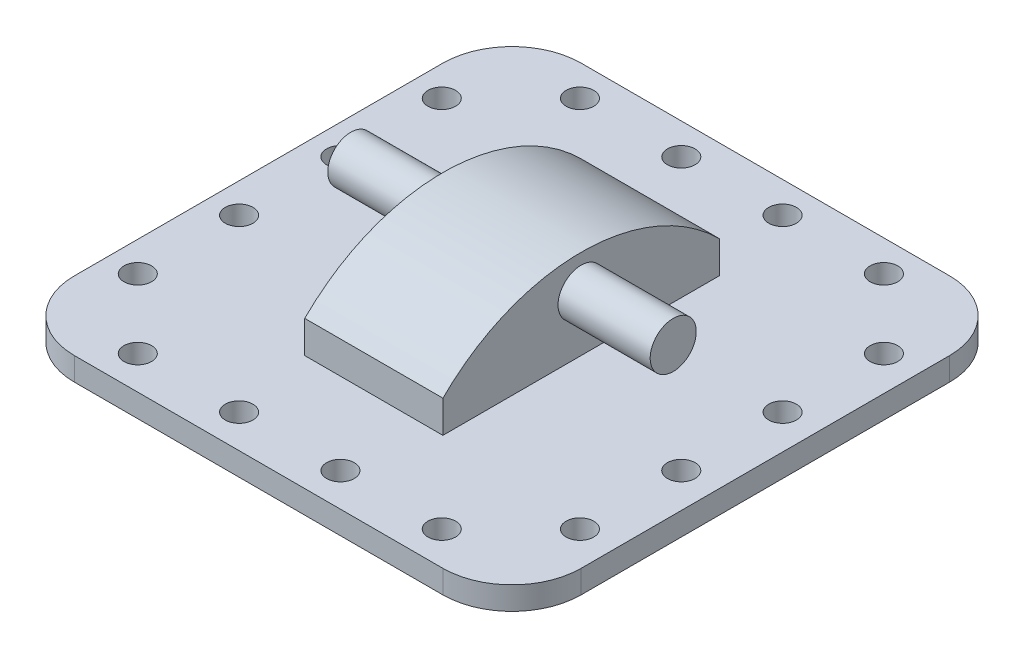
ISO-10303-21;
HEADER;
FILE_DESCRIPTION(('STEP AP214'),'2;1');
FILE_NAME('part.step','',(''),(''),'','','');
FILE_SCHEMA(('AUTOMOTIVE_DESIGN { 1 0 10303 214 1 1 1 1 }'));
ENDSEC;
DATA;
#1=APPLICATION_CONTEXT('core data for automotive mechanical design processes');
#2=APPLICATION_PROTOCOL_DEFINITION('international standard','automotive_design',2000,#1);
#3=PRODUCT_CONTEXT('',#1,'mechanical');
#4=PRODUCT('Part','Part','',(#3));
#5=PRODUCT_RELATED_PRODUCT_CATEGORY('part','',(#4));
#6=PRODUCT_DEFINITION_FORMATION('','',#4);
#7=PRODUCT_DEFINITION_CONTEXT('part definition',#1,'design');
#8=PRODUCT_DEFINITION('design','',#6,#7);
#9=PRODUCT_DEFINITION_SHAPE('','',#8);
#10=(LENGTH_UNIT() NAMED_UNIT(*) SI_UNIT(.MILLI.,.METRE.));
#11=(NAMED_UNIT(*) PLANE_ANGLE_UNIT() SI_UNIT($,.RADIAN.));
#12=(NAMED_UNIT(*) SI_UNIT($,.STERADIAN.) SOLID_ANGLE_UNIT());
#13=UNCERTAINTY_MEASURE_WITH_UNIT(LENGTH_MEASURE(1.E-05),#10,'distance_accuracy_value','');
#14=(GEOMETRIC_REPRESENTATION_CONTEXT(3) GLOBAL_UNCERTAINTY_ASSIGNED_CONTEXT((#13)) GLOBAL_UNIT_ASSIGNED_CONTEXT((#10,
#11,#12)) REPRESENTATION_CONTEXT('',''));
#15=CARTESIAN_POINT('',(0.,0.,0.));
#16=DIRECTION('',(0.,0.,1.));
#17=DIRECTION('',(1.,0.,0.));
#18=AXIS2_PLACEMENT_3D('',#15,#16,#17);
#19=CARTESIAN_POINT('',(40.,5.,55.));
#20=DIRECTION('',(0.,1.,0.));
#21=DIRECTION('',(0.,0.,1.));
#22=AXIS2_PLACEMENT_3D('',#19,#20,#21);
#23=PLANE('',#22);
#24=CARTESIAN_POINT('',(-48.5020444583901,5.,32.748977770805));
#25=DIRECTION('',(0.,-1.,0.));
#26=DIRECTION('',(0.,0.,-1.));
#27=AXIS2_PLACEMENT_3D('',#24,#25,#26);
#28=CIRCLE('',#27,3.);
#29=CARTESIAN_POINT('',(-48.5020444583901,5.,29.7489777708049));
#30=VERTEX_POINT('',#29);
#31=EDGE_CURVE('E151',#30,#30,#28,.T.);
#32=ORIENTED_EDGE('',*,*,#31,.T.);
#33=EDGE_LOOP('',(#32));
#34=FACE_BOUND('',#33,.T.);
#35=CARTESIAN_POINT('',(-11.5020444583901,5.,-48.2510222291951));
#36=DIRECTION('',(0.,-1.,0.));
#37=DIRECTION('',(0.,0.,-1.));
#38=AXIS2_PLACEMENT_3D('',#35,#36,#37);
#39=CIRCLE('',#38,3.00000000000002);
#40=CARTESIAN_POINT('',(-11.5020444583901,5.,-51.2510222291951));
#41=VERTEX_POINT('',#40);
#42=EDGE_CURVE('E155',#41,#41,#39,.T.);
#43=ORIENTED_EDGE('',*,*,#42,.T.);
#44=EDGE_LOOP('',(#43));
#45=FACE_BOUND('',#44,.T.);
#46=CARTESIAN_POINT('',(10.4979555416099,5.,-48.2510222291951));
#47=DIRECTION('',(0.,-1.,0.));
#48=DIRECTION('',(0.,0.,-1.));
#49=AXIS2_PLACEMENT_3D('',#46,#47,#48);
#50=CIRCLE('',#49,2.99999999999997);
#51=CARTESIAN_POINT('',(10.4979555416099,5.,-51.251022229195));
#52=VERTEX_POINT('',#51);
#53=EDGE_CURVE('E159',#52,#52,#50,.T.);
#54=ORIENTED_EDGE('',*,*,#53,.T.);
#55=EDGE_LOOP('',(#54));
#56=FACE_BOUND('',#55,.T.);
#57=CARTESIAN_POINT('',(47.4979555416099,5.,-11.251022229195));
#58=DIRECTION('',(0.,-1.,0.));
#59=DIRECTION('',(0.,0.,-1.));
#60=AXIS2_PLACEMENT_3D('',#57,#58,#59);
#61=CIRCLE('',#60,3.00000000000002);
#62=CARTESIAN_POINT('',(47.4979555416099,5.,-14.2510222291951));
#63=VERTEX_POINT('',#62);
#64=EDGE_CURVE('E163',#63,#63,#61,.T.);
#65=ORIENTED_EDGE('',*,*,#64,.T.);
#66=EDGE_LOOP('',(#65));
#67=FACE_BOUND('',#66,.T.);
#68=CARTESIAN_POINT('',(47.4979555416099,5.,32.748977770805));
#69=DIRECTION('',(0.,-1.,0.));
#70=DIRECTION('',(0.,0.,-1.));
#71=AXIS2_PLACEMENT_3D('',#68,#69,#70);
#72=CIRCLE('',#71,3.00000000000001);
#73=CARTESIAN_POINT('',(47.4979555416099,5.,29.7489777708049));
#74=VERTEX_POINT('',#73);
#75=EDGE_CURVE('E167',#74,#74,#72,.T.);
#76=ORIENTED_EDGE('',*,*,#75,.T.);
#77=EDGE_LOOP('',(#76));
#78=FACE_BOUND('',#77,.T.);
#79=CARTESIAN_POINT('',(-48.5020444583901,5.,10.7489777708049));
#80=DIRECTION('',(0.,-1.,0.));
#81=DIRECTION('',(0.,0.,-1.));
#82=AXIS2_PLACEMENT_3D('',#79,#80,#81);
#83=CIRCLE('',#82,2.99999999999997);
#84=CARTESIAN_POINT('',(-48.5020444583901,5.,7.74897777080498));
#85=VERTEX_POINT('',#84);
#86=EDGE_CURVE('E171',#85,#85,#83,.T.);
#87=ORIENTED_EDGE('',*,*,#86,.T.);
#88=EDGE_LOOP('',(#87));
#89=FACE_BOUND('',#88,.T.);
#90=CARTESIAN_POINT('',(-48.5020444583901,5.,-11.2510222291951));
#91=DIRECTION('',(0.,-1.,0.));
#92=DIRECTION('',(0.,0.,-1.));
#93=AXIS2_PLACEMENT_3D('',#90,#91,#92);
#94=CIRCLE('',#93,3.00000000000003);
#95=CARTESIAN_POINT('',(-48.5020444583901,5.,-14.2510222291951));
#96=VERTEX_POINT('',#95);
#97=EDGE_CURVE('E175',#96,#96,#94,.T.);
#98=ORIENTED_EDGE('',*,*,#97,.T.);
#99=EDGE_LOOP('',(#98));
#100=FACE_BOUND('',#99,.T.);
#101=CARTESIAN_POINT('',(-48.5020444583901,5.,-33.2510222291951));
#102=DIRECTION('',(0.,-1.,0.));
#103=DIRECTION('',(0.,0.,-1.));
#104=AXIS2_PLACEMENT_3D('',#101,#102,#103);
#105=CIRCLE('',#104,3.);
#106=CARTESIAN_POINT('',(-48.5020444583901,5.,-36.2510222291951));
#107=VERTEX_POINT('',#106);
#108=EDGE_CURVE('E179',#107,#107,#105,.T.);
#109=ORIENTED_EDGE('',*,*,#108,.T.);
#110=EDGE_LOOP('',(#109));
#111=FACE_BOUND('',#110,.T.);
#112=CARTESIAN_POINT('',(-33.5020444583901,5.,47.748977770805));
#113=DIRECTION('',(0.,-1.,0.));
#114=DIRECTION('',(0.,0.,-1.));
#115=AXIS2_PLACEMENT_3D('',#112,#113,#114);
#116=CIRCLE('',#115,3.00000000000001);
#117=CARTESIAN_POINT('',(-33.5020444583901,5.,44.7489777708049));
#118=VERTEX_POINT('',#117);
#119=EDGE_CURVE('E183',#118,#118,#116,.T.);
#120=ORIENTED_EDGE('',*,*,#119,.T.);
#121=EDGE_LOOP('',(#120));
#122=FACE_BOUND('',#121,.T.);
#123=CARTESIAN_POINT('',(-11.5020444583901,5.,47.7489777708049));
#124=DIRECTION('',(0.,-1.,0.));
#125=DIRECTION('',(0.,0.,-1.));
#126=AXIS2_PLACEMENT_3D('',#123,#124,#125);
#127=CIRCLE('',#126,3.00000000000002);
#128=CARTESIAN_POINT('',(-11.5020444583901,5.,44.7489777708049));
#129=VERTEX_POINT('',#128);
#130=EDGE_CURVE('E187',#129,#129,#127,.T.);
#131=ORIENTED_EDGE('',*,*,#130,.T.);
#132=EDGE_LOOP('',(#131));
#133=FACE_BOUND('',#132,.T.);
#134=CARTESIAN_POINT('',(10.4979555416099,5.,47.7489777708049));
#135=DIRECTION('',(0.,-1.,0.));
#136=DIRECTION('',(0.,0.,-1.));
#137=AXIS2_PLACEMENT_3D('',#134,#135,#136);
#138=CIRCLE('',#137,2.99999999999997);
#139=CARTESIAN_POINT('',(10.4979555416099,5.,44.748977770805));
#140=VERTEX_POINT('',#139);
#141=EDGE_CURVE('E191',#140,#140,#138,.T.);
#142=ORIENTED_EDGE('',*,*,#141,.T.);
#143=EDGE_LOOP('',(#142));
#144=FACE_BOUND('',#143,.T.);
#145=CARTESIAN_POINT('',(32.4979555416099,5.,47.7489777708049));
#146=DIRECTION('',(0.,-1.,0.));
#147=DIRECTION('',(0.,0.,-1.));
#148=AXIS2_PLACEMENT_3D('',#145,#146,#147);
#149=CIRCLE('',#148,3.00000000000001);
#150=CARTESIAN_POINT('',(32.4979555416099,5.,44.7489777708049));
#151=VERTEX_POINT('',#150);
#152=EDGE_CURVE('E195',#151,#151,#149,.T.);
#153=ORIENTED_EDGE('',*,*,#152,.T.);
#154=EDGE_LOOP('',(#153));
#155=FACE_BOUND('',#154,.T.);
#156=CARTESIAN_POINT('',(47.4979555416099,5.,10.7489777708049));
#157=DIRECTION('',(0.,-1.,0.));
#158=DIRECTION('',(0.,0.,-1.));
#159=AXIS2_PLACEMENT_3D('',#156,#157,#158);
#160=CIRCLE('',#159,2.99999999999997);
#161=CARTESIAN_POINT('',(47.4979555416099,5.,7.74897777080498));
#162=VERTEX_POINT('',#161);
#163=EDGE_CURVE('E199',#162,#162,#160,.T.);
#164=ORIENTED_EDGE('',*,*,#163,.T.);
#165=EDGE_LOOP('',(#164));
#166=FACE_BOUND('',#165,.T.);
#167=CARTESIAN_POINT('',(47.4979555416099,5.,-33.2510222291951));
#168=DIRECTION('',(0.,-1.,0.));
#169=DIRECTION('',(0.,0.,-1.));
#170=AXIS2_PLACEMENT_3D('',#167,#168,#169);
#171=CIRCLE('',#170,3.00000000000001);
#172=CARTESIAN_POINT('',(47.4979555416099,5.,-36.2510222291951));
#173=VERTEX_POINT('',#172);
#174=EDGE_CURVE('E203',#173,#173,#171,.T.);
#175=ORIENTED_EDGE('',*,*,#174,.T.);
#176=EDGE_LOOP('',(#175));
#177=FACE_BOUND('',#176,.T.);
#178=CARTESIAN_POINT('',(32.4979555416099,5.,-48.2510222291951));
#179=DIRECTION('',(0.,-1.,0.));
#180=DIRECTION('',(0.,0.,-1.));
#181=AXIS2_PLACEMENT_3D('',#178,#179,#180);
#182=CIRCLE('',#181,2.99999999999997);
#183=CARTESIAN_POINT('',(32.4979555416099,5.,-51.251022229195));
#184=VERTEX_POINT('',#183);
#185=EDGE_CURVE('E207',#184,#184,#182,.T.);
#186=ORIENTED_EDGE('',*,*,#185,.T.);
#187=EDGE_LOOP('',(#186));
#188=FACE_BOUND('',#187,.T.);
#189=CARTESIAN_POINT('',(-33.5020444583901,5.,-48.2510222291951));
#190=DIRECTION('',(0.,-1.,0.));
#191=DIRECTION('',(0.,0.,-1.));
#192=AXIS2_PLACEMENT_3D('',#189,#190,#191);
#193=CIRCLE('',#192,3.00000000000001);
#194=CARTESIAN_POINT('',(-33.5020444583901,5.,-51.2510222291951));
#195=VERTEX_POINT('',#194);
#196=EDGE_CURVE('E211',#195,#195,#193,.T.);
#197=ORIENTED_EDGE('',*,*,#196,.T.);
#198=EDGE_LOOP('',(#197));
#199=FACE_BOUND('',#198,.T.);
#200=DIRECTION('',(1.,0.,0.));
#201=VECTOR('',#200,1.);
#202=CARTESIAN_POINT('',(-55.,5.,55.));
#203=LINE('',#202,#201);
#204=CARTESIAN_POINT('',(-40.,5.,55.));
#205=VERTEX_POINT('',#204);
#206=CARTESIAN_POINT('',(40.,5.,55.));
#207=VERTEX_POINT('',#206);
#208=EDGE_CURVE('E122',#205,#207,#203,.T.);
#209=ORIENTED_EDGE('',*,*,#208,.T.);
#210=CARTESIAN_POINT('',(40.,5.,40.));
#211=DIRECTION('',(0.,-1.,0.));
#212=DIRECTION('',(0.,0.,-1.));
#213=AXIS2_PLACEMENT_3D('',#210,#211,#212);
#214=CIRCLE('',#213,15.);
#215=CARTESIAN_POINT('',(55.,5.,40.));
#216=VERTEX_POINT('',#215);
#217=EDGE_CURVE('E119',#207,#216,#214,.F.);
#218=ORIENTED_EDGE('',*,*,#217,.T.);
#219=DIRECTION('',(0.,0.,-1.));
#220=VECTOR('',#219,1.);
#221=CARTESIAN_POINT('',(55.,5.,55.));
#222=LINE('',#221,#220);
#223=CARTESIAN_POINT('',(55.,5.,-40.));
#224=VERTEX_POINT('',#223);
#225=EDGE_CURVE('E77',#216,#224,#222,.T.);
#226=ORIENTED_EDGE('',*,*,#225,.T.);
#227=CARTESIAN_POINT('',(40.,5.,-40.));
#228=DIRECTION('',(0.,-1.,0.));
#229=DIRECTION('',(0.,0.,-1.));
#230=AXIS2_PLACEMENT_3D('',#227,#228,#229);
#231=CIRCLE('',#230,15.);
#232=CARTESIAN_POINT('',(40.,5.,-55.));
#233=VERTEX_POINT('',#232);
#234=EDGE_CURVE('E345',#224,#233,#231,.F.);
#235=ORIENTED_EDGE('',*,*,#234,.T.);
#236=DIRECTION('',(-1.,0.,0.));
#237=VECTOR('',#236,1.);
#238=CARTESIAN_POINT('',(-55.,5.,-55.));
#239=LINE('',#238,#237);
#240=CARTESIAN_POINT('',(-40.,5.,-55.));
#241=VERTEX_POINT('',#240);
#242=EDGE_CURVE('E139',#233,#241,#239,.T.);
#243=ORIENTED_EDGE('',*,*,#242,.T.);
#244=CARTESIAN_POINT('',(-40.,5.,-40.));
#245=DIRECTION('',(0.,-1.,0.));
#246=DIRECTION('',(0.,0.,-1.));
#247=AXIS2_PLACEMENT_3D('',#244,#245,#246);
#248=CIRCLE('',#247,15.);
#249=CARTESIAN_POINT('',(-55.,5.,-40.));
#250=VERTEX_POINT('',#249);
#251=EDGE_CURVE('E313',#241,#250,#248,.F.);
#252=ORIENTED_EDGE('',*,*,#251,.T.);
#253=DIRECTION('',(0.,0.,1.));
#254=VECTOR('',#253,1.);
#255=CARTESIAN_POINT('',(-55.,5.,55.));
#256=LINE('',#255,#254);
#257=CARTESIAN_POINT('',(-55.,5.,40.));
#258=VERTEX_POINT('',#257);
#259=EDGE_CURVE('E147',#250,#258,#256,.T.);
#260=ORIENTED_EDGE('',*,*,#259,.T.);
#261=CARTESIAN_POINT('',(-40.,5.,40.));
#262=DIRECTION('',(0.,-1.,0.));
#263=DIRECTION('',(0.,0.,-1.));
#264=AXIS2_PLACEMENT_3D('',#261,#262,#263);
#265=CIRCLE('',#264,15.);
#266=EDGE_CURVE('E311',#258,#205,#265,.F.);
#267=ORIENTED_EDGE('',*,*,#266,.T.);
#268=EDGE_LOOP('',(#209,#218,#226,#235,#243,#252,#260,#267));
#269=FACE_BOUND('',#268,.T.);
#270=ADVANCED_FACE('F52',(#34,#45,#56,#67,#78,#89,#100,#111,#122,#133,#144,#155,#166,#177,#188,
#199,#269),#23,.T.);
#271=CARTESIAN_POINT('',(40.,5.,-40.));
#272=DIRECTION('',(0.,1.,0.));
#273=DIRECTION('',(0.,0.,1.));
#274=AXIS2_PLACEMENT_3D('',#271,#272,#273);
#275=CYLINDRICAL_SURFACE('',#274,15.);
#276=DIRECTION('',(0.,1.,0.));
#277=VECTOR('',#276,1.);
#278=CARTESIAN_POINT('',(55.,5.,-40.));
#279=LINE('',#278,#277);
#280=CARTESIAN_POINT('',(55.,0.,-40.));
#281=VERTEX_POINT('',#280);
#282=EDGE_CURVE('E136',#281,#224,#279,.T.);
#283=ORIENTED_EDGE('',*,*,#282,.F.);
#284=CARTESIAN_POINT('',(40.,0.,-40.));
#285=DIRECTION('',(0.,-1.,0.));
#286=DIRECTION('',(0.,0.,-1.));
#287=AXIS2_PLACEMENT_3D('',#284,#285,#286);
#288=CIRCLE('',#287,15.);
#289=CARTESIAN_POINT('',(40.,0.,-55.));
#290=VERTEX_POINT('',#289);
#291=EDGE_CURVE('E298',#290,#281,#288,.T.);
#292=ORIENTED_EDGE('',*,*,#291,.F.);
#293=DIRECTION('',(0.,1.,0.));
#294=VECTOR('',#293,1.);
#295=CARTESIAN_POINT('',(40.,5.,-55.));
#296=LINE('',#295,#294);
#297=EDGE_CURVE('E350',#233,#290,#296,.F.);
#298=ORIENTED_EDGE('',*,*,#297,.F.);
#299=ORIENTED_EDGE('',*,*,#234,.F.);
#300=EDGE_LOOP('',(#283,#292,#298,#299));
#301=FACE_BOUND('',#300,.T.);
#302=ADVANCED_FACE('F364',(#301),#275,.T.);
#303=CARTESIAN_POINT('',(-40.,5.,-40.));
#304=DIRECTION('',(0.,1.,0.));
#305=DIRECTION('',(0.,0.,1.));
#306=AXIS2_PLACEMENT_3D('',#303,#304,#305);
#307=CYLINDRICAL_SURFACE('',#306,15.);
#308=DIRECTION('',(0.,1.,0.));
#309=VECTOR('',#308,1.);
#310=CARTESIAN_POINT('',(-40.,5.,-55.));
#311=LINE('',#310,#309);
#312=CARTESIAN_POINT('',(-40.,0.,-55.));
#313=VERTEX_POINT('',#312);
#314=EDGE_CURVE('E341',#313,#241,#311,.T.);
#315=ORIENTED_EDGE('',*,*,#314,.F.);
#316=CARTESIAN_POINT('',(-40.,0.,-40.));
#317=DIRECTION('',(0.,-1.,0.));
#318=DIRECTION('',(0.,0.,-1.));
#319=AXIS2_PLACEMENT_3D('',#316,#317,#318);
#320=CIRCLE('',#319,15.);
#321=CARTESIAN_POINT('',(-55.,0.,-40.));
#322=VERTEX_POINT('',#321);
#323=EDGE_CURVE('E330',#322,#313,#320,.T.);
#324=ORIENTED_EDGE('',*,*,#323,.F.);
#325=DIRECTION('',(0.,1.,0.));
#326=VECTOR('',#325,1.);
#327=CARTESIAN_POINT('',(-55.,5.,-40.));
#328=LINE('',#327,#326);
#329=EDGE_CURVE('E320',#250,#322,#328,.F.);
#330=ORIENTED_EDGE('',*,*,#329,.F.);
#331=ORIENTED_EDGE('',*,*,#251,.F.);
#332=EDGE_LOOP('',(#315,#324,#330,#331));
#333=FACE_BOUND('',#332,.T.);
#334=ADVANCED_FACE('F363',(#333),#307,.T.);
#335=CARTESIAN_POINT('',(-40.,5.,40.));
#336=DIRECTION('',(0.,1.,0.));
#337=DIRECTION('',(0.,0.,1.));
#338=AXIS2_PLACEMENT_3D('',#335,#336,#337);
#339=CYLINDRICAL_SURFACE('',#338,15.);
#340=DIRECTION('',(0.,1.,0.));
#341=VECTOR('',#340,1.);
#342=CARTESIAN_POINT('',(-55.,5.,40.));
#343=LINE('',#342,#341);
#344=CARTESIAN_POINT('',(-55.,0.,40.));
#345=VERTEX_POINT('',#344);
#346=EDGE_CURVE('E323',#345,#258,#343,.T.);
#347=ORIENTED_EDGE('',*,*,#346,.F.);
#348=CARTESIAN_POINT('',(-40.,0.,40.));
#349=DIRECTION('',(0.,-1.,0.));
#350=DIRECTION('',(0.,0.,-1.));
#351=AXIS2_PLACEMENT_3D('',#348,#349,#350);
#352=CIRCLE('',#351,15.);
#353=CARTESIAN_POINT('',(-40.,0.,55.));
#354=VERTEX_POINT('',#353);
#355=EDGE_CURVE('E333',#354,#345,#352,.T.);
#356=ORIENTED_EDGE('',*,*,#355,.F.);
#357=DIRECTION('',(0.,1.,0.));
#358=VECTOR('',#357,1.);
#359=CARTESIAN_POINT('',(-40.,5.,55.));
#360=LINE('',#359,#358);
#361=EDGE_CURVE('E326',#205,#354,#360,.F.);
#362=ORIENTED_EDGE('',*,*,#361,.F.);
#363=ORIENTED_EDGE('',*,*,#266,.F.);
#364=EDGE_LOOP('',(#347,#356,#362,#363));
#365=FACE_BOUND('',#364,.T.);
#366=ADVANCED_FACE('F371',(#365),#339,.T.);
#367=CARTESIAN_POINT('',(40.,5.,40.));
#368=DIRECTION('',(0.,1.,0.));
#369=DIRECTION('',(0.,0.,1.));
#370=AXIS2_PLACEMENT_3D('',#367,#368,#369);
#371=CYLINDRICAL_SURFACE('',#370,15.);
#372=DIRECTION('',(0.,1.,0.));
#373=VECTOR('',#372,1.);
#374=CARTESIAN_POINT('',(40.,5.,55.));
#375=LINE('',#374,#373);
#376=CARTESIAN_POINT('',(40.,0.,55.));
#377=VERTEX_POINT('',#376);
#378=EDGE_CURVE('E132',#377,#207,#375,.T.);
#379=ORIENTED_EDGE('',*,*,#378,.F.);
#380=CARTESIAN_POINT('',(40.,0.,40.));
#381=DIRECTION('',(0.,-1.,0.));
#382=DIRECTION('',(0.,0.,-1.));
#383=AXIS2_PLACEMENT_3D('',#380,#381,#382);
#384=CIRCLE('',#383,15.);
#385=CARTESIAN_POINT('',(55.,0.,40.));
#386=VERTEX_POINT('',#385);
#387=EDGE_CURVE('E127',#386,#377,#384,.T.);
#388=ORIENTED_EDGE('',*,*,#387,.F.);
#389=DIRECTION('',(0.,1.,0.));
#390=VECTOR('',#389,1.);
#391=CARTESIAN_POINT('',(55.,5.,40.));
#392=LINE('',#391,#390);
#393=EDGE_CURVE('E129',#216,#386,#392,.F.);
#394=ORIENTED_EDGE('',*,*,#393,.F.);
#395=ORIENTED_EDGE('',*,*,#217,.F.);
#396=EDGE_LOOP('',(#379,#388,#394,#395));
#397=FACE_BOUND('',#396,.T.);
#398=ADVANCED_FACE('F130',(#397),#371,.T.);
#399=CARTESIAN_POINT('',(0.,0.,0.));
#400=DIRECTION('',(0.,-1.,0.));
#401=DIRECTION('',(0.,0.,-1.));
#402=AXIS2_PLACEMENT_3D('',#399,#400,#401);
#403=PLANE('',#402);
#404=CARTESIAN_POINT('',(-48.5020444583901,0.,32.748977770805));
#405=DIRECTION('',(0.,-1.,0.));
#406=DIRECTION('',(0.,0.,-1.));
#407=AXIS2_PLACEMENT_3D('',#404,#405,#406);
#408=CIRCLE('',#407,3.);
#409=CARTESIAN_POINT('',(-48.5020444583901,0.,29.7489777708049));
#410=VERTEX_POINT('',#409);
#411=EDGE_CURVE('E236',#410,#410,#408,.T.);
#412=ORIENTED_EDGE('',*,*,#411,.F.);
#413=EDGE_LOOP('',(#412));
#414=FACE_BOUND('',#413,.T.);
#415=CARTESIAN_POINT('',(-11.5020444583901,0.,-48.2510222291951));
#416=DIRECTION('',(0.,-1.,0.));
#417=DIRECTION('',(0.,0.,-1.));
#418=AXIS2_PLACEMENT_3D('',#415,#416,#417);
#419=CIRCLE('',#418,3.00000000000002);
#420=CARTESIAN_POINT('',(-11.5020444583901,0.,-51.2510222291951));
#421=VERTEX_POINT('',#420);
#422=EDGE_CURVE('E240',#421,#421,#419,.T.);
#423=ORIENTED_EDGE('',*,*,#422,.F.);
#424=EDGE_LOOP('',(#423));
#425=FACE_BOUND('',#424,.T.);
#426=CARTESIAN_POINT('',(10.4979555416099,0.,-48.2510222291951));
#427=DIRECTION('',(0.,-1.,0.));
#428=DIRECTION('',(0.,0.,-1.));
#429=AXIS2_PLACEMENT_3D('',#426,#427,#428);
#430=CIRCLE('',#429,2.99999999999997);
#431=CARTESIAN_POINT('',(10.4979555416099,0.,-51.251022229195));
#432=VERTEX_POINT('',#431);
#433=EDGE_CURVE('E244',#432,#432,#430,.T.);
#434=ORIENTED_EDGE('',*,*,#433,.F.);
#435=EDGE_LOOP('',(#434));
#436=FACE_BOUND('',#435,.T.);
#437=CARTESIAN_POINT('',(47.4979555416099,0.,-11.251022229195));
#438=DIRECTION('',(0.,-1.,0.));
#439=DIRECTION('',(0.,0.,-1.));
#440=AXIS2_PLACEMENT_3D('',#437,#438,#439);
#441=CIRCLE('',#440,3.00000000000002);
#442=CARTESIAN_POINT('',(47.4979555416099,0.,-14.2510222291951));
#443=VERTEX_POINT('',#442);
#444=EDGE_CURVE('E224',#443,#443,#441,.T.);
#445=ORIENTED_EDGE('',*,*,#444,.F.);
#446=EDGE_LOOP('',(#445));
#447=FACE_BOUND('',#446,.T.);
#448=CARTESIAN_POINT('',(47.4979555416099,0.,32.748977770805));
#449=DIRECTION('',(0.,-1.,0.));
#450=DIRECTION('',(0.,0.,-1.));
#451=AXIS2_PLACEMENT_3D('',#448,#449,#450);
#452=CIRCLE('',#451,3.00000000000001);
#453=CARTESIAN_POINT('',(47.4979555416099,0.,29.7489777708049));
#454=VERTEX_POINT('',#453);
#455=EDGE_CURVE('E220',#454,#454,#452,.T.);
#456=ORIENTED_EDGE('',*,*,#455,.F.);
#457=EDGE_LOOP('',(#456));
#458=FACE_BOUND('',#457,.T.);
#459=CARTESIAN_POINT('',(-48.5020444583901,0.,10.7489777708049));
#460=DIRECTION('',(0.,-1.,0.));
#461=DIRECTION('',(0.,0.,-1.));
#462=AXIS2_PLACEMENT_3D('',#459,#460,#461);
#463=CIRCLE('',#462,2.99999999999997);
#464=CARTESIAN_POINT('',(-48.5020444583901,0.,7.74897777080498));
#465=VERTEX_POINT('',#464);
#466=EDGE_CURVE('E225',#465,#465,#463,.T.);
#467=ORIENTED_EDGE('',*,*,#466,.F.);
#468=EDGE_LOOP('',(#467));
#469=FACE_BOUND('',#468,.T.);
#470=CARTESIAN_POINT('',(-48.5020444583901,0.,-11.2510222291951));
#471=DIRECTION('',(0.,-1.,0.));
#472=DIRECTION('',(0.,0.,-1.));
#473=AXIS2_PLACEMENT_3D('',#470,#471,#472);
#474=CIRCLE('',#473,3.00000000000003);
#475=CARTESIAN_POINT('',(-48.5020444583901,0.,-14.2510222291951));
#476=VERTEX_POINT('',#475);
#477=EDGE_CURVE('E229',#476,#476,#474,.T.);
#478=ORIENTED_EDGE('',*,*,#477,.F.);
#479=EDGE_LOOP('',(#478));
#480=FACE_BOUND('',#479,.T.);
#481=CARTESIAN_POINT('',(-48.5020444583901,0.,-33.2510222291951));
#482=DIRECTION('',(0.,-1.,0.));
#483=DIRECTION('',(0.,0.,-1.));
#484=AXIS2_PLACEMENT_3D('',#481,#482,#483);
#485=CIRCLE('',#484,3.);
#486=CARTESIAN_POINT('',(-48.5020444583901,0.,-36.2510222291951));
#487=VERTEX_POINT('',#486);
#488=EDGE_CURVE('E219',#487,#487,#485,.T.);
#489=ORIENTED_EDGE('',*,*,#488,.F.);
#490=EDGE_LOOP('',(#489));
#491=FACE_BOUND('',#490,.T.);
#492=CARTESIAN_POINT('',(-33.5020444583901,0.,47.748977770805));
#493=DIRECTION('',(0.,-1.,0.));
#494=DIRECTION('',(0.,0.,-1.));
#495=AXIS2_PLACEMENT_3D('',#492,#493,#494);
#496=CIRCLE('',#495,3.00000000000001);
#497=CARTESIAN_POINT('',(-33.5020444583901,0.,44.7489777708049));
#498=VERTEX_POINT('',#497);
#499=EDGE_CURVE('E55',#498,#498,#496,.T.);
#500=ORIENTED_EDGE('',*,*,#499,.F.);
#501=EDGE_LOOP('',(#500));
#502=FACE_BOUND('',#501,.T.);
#503=CARTESIAN_POINT('',(-11.5020444583901,0.,47.7489777708049));
#504=DIRECTION('',(0.,-1.,0.));
#505=DIRECTION('',(0.,0.,-1.));
#506=AXIS2_PLACEMENT_3D('',#503,#504,#505);
#507=CIRCLE('',#506,3.00000000000002);
#508=CARTESIAN_POINT('',(-11.5020444583901,0.,44.7489777708049));
#509=VERTEX_POINT('',#508);
#510=EDGE_CURVE('E265',#509,#509,#507,.T.);
#511=ORIENTED_EDGE('',*,*,#510,.F.);
#512=EDGE_LOOP('',(#511));
#513=FACE_BOUND('',#512,.T.);
#514=CARTESIAN_POINT('',(10.4979555416099,0.,47.7489777708049));
#515=DIRECTION('',(0.,-1.,0.));
#516=DIRECTION('',(0.,0.,-1.));
#517=AXIS2_PLACEMENT_3D('',#514,#515,#516);
#518=CIRCLE('',#517,2.99999999999997);
#519=CARTESIAN_POINT('',(10.4979555416099,0.,44.748977770805));
#520=VERTEX_POINT('',#519);
#521=EDGE_CURVE('E262',#520,#520,#518,.T.);
#522=ORIENTED_EDGE('',*,*,#521,.F.);
#523=EDGE_LOOP('',(#522));
#524=FACE_BOUND('',#523,.T.);
#525=CARTESIAN_POINT('',(32.4979555416099,0.,47.7489777708049));
#526=DIRECTION('',(0.,-1.,0.));
#527=DIRECTION('',(0.,0.,-1.));
#528=AXIS2_PLACEMENT_3D('',#525,#526,#527);
#529=CIRCLE('',#528,3.00000000000001);
#530=CARTESIAN_POINT('',(32.4979555416099,0.,44.7489777708049));
#531=VERTEX_POINT('',#530);
#532=EDGE_CURVE('E258',#531,#531,#529,.T.);
#533=ORIENTED_EDGE('',*,*,#532,.F.);
#534=EDGE_LOOP('',(#533));
#535=FACE_BOUND('',#534,.T.);
#536=CARTESIAN_POINT('',(47.4979555416099,0.,10.7489777708049));
#537=DIRECTION('',(0.,-1.,0.));
#538=DIRECTION('',(0.,0.,-1.));
#539=AXIS2_PLACEMENT_3D('',#536,#537,#538);
#540=CIRCLE('',#539,2.99999999999997);
#541=CARTESIAN_POINT('',(47.4979555416099,0.,7.74897777080498));
#542=VERTEX_POINT('',#541);
#543=EDGE_CURVE('E254',#542,#542,#540,.T.);
#544=ORIENTED_EDGE('',*,*,#543,.F.);
#545=EDGE_LOOP('',(#544));
#546=FACE_BOUND('',#545,.T.);
#547=CARTESIAN_POINT('',(47.4979555416099,0.,-33.2510222291951));
#548=DIRECTION('',(0.,-1.,0.));
#549=DIRECTION('',(0.,0.,-1.));
#550=AXIS2_PLACEMENT_3D('',#547,#548,#549);
#551=CIRCLE('',#550,3.00000000000001);
#552=CARTESIAN_POINT('',(47.4979555416099,0.,-36.2510222291951));
#553=VERTEX_POINT('',#552);
#554=EDGE_CURVE('E61',#553,#553,#551,.T.);
#555=ORIENTED_EDGE('',*,*,#554,.F.);
#556=EDGE_LOOP('',(#555));
#557=FACE_BOUND('',#556,.T.);
#558=CARTESIAN_POINT('',(32.4979555416099,0.,-48.2510222291951));
#559=DIRECTION('',(0.,-1.,0.));
#560=DIRECTION('',(0.,0.,-1.));
#561=AXIS2_PLACEMENT_3D('',#558,#559,#560);
#562=CIRCLE('',#561,2.99999999999997);
#563=CARTESIAN_POINT('',(32.4979555416099,0.,-51.251022229195));
#564=VERTEX_POINT('',#563);
#565=EDGE_CURVE('E12',#564,#564,#562,.T.);
#566=ORIENTED_EDGE('',*,*,#565,.F.);
#567=EDGE_LOOP('',(#566));
#568=FACE_BOUND('',#567,.T.);
#569=CARTESIAN_POINT('',(-33.5020444583901,0.,-48.2510222291951));
#570=DIRECTION('',(0.,-1.,0.));
#571=DIRECTION('',(0.,0.,-1.));
#572=AXIS2_PLACEMENT_3D('',#569,#570,#571);
#573=CIRCLE('',#572,3.00000000000001);
#574=CARTESIAN_POINT('',(-33.5020444583901,0.,-51.2510222291951));
#575=VERTEX_POINT('',#574);
#576=EDGE_CURVE('E215',#575,#575,#573,.T.);
#577=ORIENTED_EDGE('',*,*,#576,.F.);
#578=EDGE_LOOP('',(#577));
#579=FACE_BOUND('',#578,.T.);
#580=DIRECTION('',(0.,0.,-1.));
#581=VECTOR('',#580,1.);
#582=CARTESIAN_POINT('',(55.,0.,55.));
#583=LINE('',#582,#581);
#584=EDGE_CURVE('E69',#386,#281,#583,.T.);
#585=ORIENTED_EDGE('',*,*,#584,.F.);
#586=ORIENTED_EDGE('',*,*,#387,.T.);
#587=DIRECTION('',(1.,0.,0.));
#588=VECTOR('',#587,1.);
#589=CARTESIAN_POINT('',(-55.,0.,55.));
#590=LINE('',#589,#588);
#591=EDGE_CURVE('E138',#354,#377,#590,.T.);
#592=ORIENTED_EDGE('',*,*,#591,.F.);
#593=ORIENTED_EDGE('',*,*,#355,.T.);
#594=DIRECTION('',(0.,0.,1.));
#595=VECTOR('',#594,1.);
#596=CARTESIAN_POINT('',(-55.,0.,55.));
#597=LINE('',#596,#595);
#598=EDGE_CURVE('E144',#322,#345,#597,.T.);
#599=ORIENTED_EDGE('',*,*,#598,.F.);
#600=ORIENTED_EDGE('',*,*,#323,.T.);
#601=DIRECTION('',(-1.,0.,0.));
#602=VECTOR('',#601,1.);
#603=CARTESIAN_POINT('',(-55.,0.,-55.));
#604=LINE('',#603,#602);
#605=EDGE_CURVE('E300',#290,#313,#604,.T.);
#606=ORIENTED_EDGE('',*,*,#605,.F.);
#607=ORIENTED_EDGE('',*,*,#291,.T.);
#608=EDGE_LOOP('',(#585,#586,#592,#593,#599,#600,#606,#607));
#609=FACE_BOUND('',#608,.T.);
#610=ADVANCED_FACE('F277',(#414,#425,#436,#447,#458,#469,#480,#491,#502,#513,#524,#535,#546,
#557,#568,#579,#609),#403,.T.);
#611=CARTESIAN_POINT('',(-48.5020444583901,10.,32.748977770805));
#612=DIRECTION('',(0.,-1.,0.));
#613=DIRECTION('',(0.,0.,-1.));
#614=AXIS2_PLACEMENT_3D('',#611,#612,#613);
#615=CYLINDRICAL_SURFACE('',#614,3.);
#616=ORIENTED_EDGE('',*,*,#411,.T.);
#617=EDGE_LOOP('',(#616));
#618=FACE_BOUND('',#617,.T.);
#619=ORIENTED_EDGE('',*,*,#31,.F.);
#620=EDGE_LOOP('',(#619));
#621=FACE_BOUND('',#620,.T.);
#622=ADVANCED_FACE('F280',(#618,#621),#615,.F.);
#623=CARTESIAN_POINT('',(-11.5020444583901,10.,-48.2510222291951));
#624=DIRECTION('',(0.,-1.,0.));
#625=DIRECTION('',(0.,0.,-1.));
#626=AXIS2_PLACEMENT_3D('',#623,#624,#625);
#627=CYLINDRICAL_SURFACE('',#626,3.00000000000002);
#628=ORIENTED_EDGE('',*,*,#422,.T.);
#629=EDGE_LOOP('',(#628));
#630=FACE_BOUND('',#629,.T.);
#631=ORIENTED_EDGE('',*,*,#42,.F.);
#632=EDGE_LOOP('',(#631));
#633=FACE_BOUND('',#632,.T.);
#634=ADVANCED_FACE('F410',(#630,#633),#627,.F.);
#635=CARTESIAN_POINT('',(10.4979555416099,10.,-48.2510222291951));
#636=DIRECTION('',(0.,-1.,0.));
#637=DIRECTION('',(0.,0.,-1.));
#638=AXIS2_PLACEMENT_3D('',#635,#636,#637);
#639=CYLINDRICAL_SURFACE('',#638,2.99999999999997);
#640=ORIENTED_EDGE('',*,*,#433,.T.);
#641=EDGE_LOOP('',(#640));
#642=FACE_BOUND('',#641,.T.);
#643=ORIENTED_EDGE('',*,*,#53,.F.);
#644=EDGE_LOOP('',(#643));
#645=FACE_BOUND('',#644,.T.);
#646=ADVANCED_FACE('F414',(#642,#645),#639,.F.);
#647=CARTESIAN_POINT('',(47.4979555416099,10.,-11.251022229195));
#648=DIRECTION('',(0.,-1.,0.));
#649=DIRECTION('',(0.,0.,-1.));
#650=AXIS2_PLACEMENT_3D('',#647,#648,#649);
#651=CYLINDRICAL_SURFACE('',#650,3.00000000000002);
#652=ORIENTED_EDGE('',*,*,#444,.T.);
#653=EDGE_LOOP('',(#652));
#654=FACE_BOUND('',#653,.T.);
#655=ORIENTED_EDGE('',*,*,#64,.F.);
#656=EDGE_LOOP('',(#655));
#657=FACE_BOUND('',#656,.T.);
#658=ADVANCED_FACE('F395',(#654,#657),#651,.F.);
#659=CARTESIAN_POINT('',(47.4979555416099,10.,32.748977770805));
#660=DIRECTION('',(0.,-1.,0.));
#661=DIRECTION('',(0.,0.,-1.));
#662=AXIS2_PLACEMENT_3D('',#659,#660,#661);
#663=CYLINDRICAL_SURFACE('',#662,3.00000000000001);
#664=ORIENTED_EDGE('',*,*,#455,.T.);
#665=EDGE_LOOP('',(#664));
#666=FACE_BOUND('',#665,.T.);
#667=ORIENTED_EDGE('',*,*,#75,.F.);
#668=EDGE_LOOP('',(#667));
#669=FACE_BOUND('',#668,.T.);
#670=ADVANCED_FACE('F391',(#666,#669),#663,.F.);
#671=CARTESIAN_POINT('',(-48.5020444583901,10.,10.7489777708049));
#672=DIRECTION('',(0.,-1.,0.));
#673=DIRECTION('',(0.,0.,-1.));
#674=AXIS2_PLACEMENT_3D('',#671,#672,#673);
#675=CYLINDRICAL_SURFACE('',#674,2.99999999999997);
#676=ORIENTED_EDGE('',*,*,#466,.T.);
#677=EDGE_LOOP('',(#676));
#678=FACE_BOUND('',#677,.T.);
#679=ORIENTED_EDGE('',*,*,#86,.F.);
#680=EDGE_LOOP('',(#679));
#681=FACE_BOUND('',#680,.T.);
#682=ADVANCED_FACE('F394',(#678,#681),#675,.F.);
#683=CARTESIAN_POINT('',(-48.5020444583901,10.,-11.2510222291951));
#684=DIRECTION('',(0.,-1.,0.));
#685=DIRECTION('',(0.,0.,-1.));
#686=AXIS2_PLACEMENT_3D('',#683,#684,#685);
#687=CYLINDRICAL_SURFACE('',#686,3.00000000000003);
#688=ORIENTED_EDGE('',*,*,#477,.T.);
#689=EDGE_LOOP('',(#688));
#690=FACE_BOUND('',#689,.T.);
#691=ORIENTED_EDGE('',*,*,#97,.F.);
#692=EDGE_LOOP('',(#691));
#693=FACE_BOUND('',#692,.T.);
#694=ADVANCED_FACE('F399',(#690,#693),#687,.F.);
#695=CARTESIAN_POINT('',(-48.5020444583901,10.,-33.2510222291951));
#696=DIRECTION('',(0.,-1.,0.));
#697=DIRECTION('',(0.,0.,-1.));
#698=AXIS2_PLACEMENT_3D('',#695,#696,#697);
#699=CYLINDRICAL_SURFACE('',#698,3.);
#700=ORIENTED_EDGE('',*,*,#488,.T.);
#701=EDGE_LOOP('',(#700));
#702=FACE_BOUND('',#701,.T.);
#703=ORIENTED_EDGE('',*,*,#108,.F.);
#704=EDGE_LOOP('',(#703));
#705=FACE_BOUND('',#704,.T.);
#706=ADVANCED_FACE('F403',(#702,#705),#699,.F.);
#707=CARTESIAN_POINT('',(-33.5020444583901,10.,47.748977770805));
#708=DIRECTION('',(0.,-1.,0.));
#709=DIRECTION('',(0.,0.,-1.));
#710=AXIS2_PLACEMENT_3D('',#707,#708,#709);
#711=CYLINDRICAL_SURFACE('',#710,3.00000000000001);
#712=ORIENTED_EDGE('',*,*,#499,.T.);
#713=EDGE_LOOP('',(#712));
#714=FACE_BOUND('',#713,.T.);
#715=ORIENTED_EDGE('',*,*,#119,.F.);
#716=EDGE_LOOP('',(#715));
#717=FACE_BOUND('',#716,.T.);
#718=ADVANCED_FACE('F274',(#714,#717),#711,.F.);
#719=CARTESIAN_POINT('',(-11.5020444583901,10.,47.7489777708049));
#720=DIRECTION('',(0.,-1.,0.));
#721=DIRECTION('',(0.,0.,-1.));
#722=AXIS2_PLACEMENT_3D('',#719,#720,#721);
#723=CYLINDRICAL_SURFACE('',#722,3.00000000000002);
#724=ORIENTED_EDGE('',*,*,#510,.T.);
#725=EDGE_LOOP('',(#724));
#726=FACE_BOUND('',#725,.T.);
#727=ORIENTED_EDGE('',*,*,#130,.F.);
#728=EDGE_LOOP('',(#727));
#729=FACE_BOUND('',#728,.T.);
#730=ADVANCED_FACE('F440',(#726,#729),#723,.F.);
#731=CARTESIAN_POINT('',(10.4979555416099,10.,47.7489777708049));
#732=DIRECTION('',(0.,-1.,0.));
#733=DIRECTION('',(0.,0.,-1.));
#734=AXIS2_PLACEMENT_3D('',#731,#732,#733);
#735=CYLINDRICAL_SURFACE('',#734,2.99999999999997);
#736=ORIENTED_EDGE('',*,*,#521,.T.);
#737=EDGE_LOOP('',(#736));
#738=FACE_BOUND('',#737,.T.);
#739=ORIENTED_EDGE('',*,*,#141,.F.);
#740=EDGE_LOOP('',(#739));
#741=FACE_BOUND('',#740,.T.);
#742=ADVANCED_FACE('F436',(#738,#741),#735,.F.);
#743=CARTESIAN_POINT('',(32.4979555416099,10.,47.7489777708049));
#744=DIRECTION('',(0.,-1.,0.));
#745=DIRECTION('',(0.,0.,-1.));
#746=AXIS2_PLACEMENT_3D('',#743,#744,#745);
#747=CYLINDRICAL_SURFACE('',#746,3.00000000000001);
#748=ORIENTED_EDGE('',*,*,#532,.T.);
#749=EDGE_LOOP('',(#748));
#750=FACE_BOUND('',#749,.T.);
#751=ORIENTED_EDGE('',*,*,#152,.F.);
#752=EDGE_LOOP('',(#751));
#753=FACE_BOUND('',#752,.T.);
#754=ADVANCED_FACE('F432',(#750,#753),#747,.F.);
#755=CARTESIAN_POINT('',(47.4979555416099,10.,10.7489777708049));
#756=DIRECTION('',(0.,-1.,0.));
#757=DIRECTION('',(0.,0.,-1.));
#758=AXIS2_PLACEMENT_3D('',#755,#756,#757);
#759=CYLINDRICAL_SURFACE('',#758,2.99999999999997);
#760=ORIENTED_EDGE('',*,*,#543,.T.);
#761=EDGE_LOOP('',(#760));
#762=FACE_BOUND('',#761,.T.);
#763=ORIENTED_EDGE('',*,*,#163,.F.);
#764=EDGE_LOOP('',(#763));
#765=FACE_BOUND('',#764,.T.);
#766=ADVANCED_FACE('F428',(#762,#765),#759,.F.);
#767=CARTESIAN_POINT('',(47.4979555416099,10.,-33.2510222291951));
#768=DIRECTION('',(0.,-1.,0.));
#769=DIRECTION('',(0.,0.,-1.));
#770=AXIS2_PLACEMENT_3D('',#767,#768,#769);
#771=CYLINDRICAL_SURFACE('',#770,3.00000000000001);
#772=ORIENTED_EDGE('',*,*,#554,.T.);
#773=EDGE_LOOP('',(#772));
#774=FACE_BOUND('',#773,.T.);
#775=ORIENTED_EDGE('',*,*,#174,.F.);
#776=EDGE_LOOP('',(#775));
#777=FACE_BOUND('',#776,.T.);
#778=ADVANCED_FACE('F424',(#774,#777),#771,.F.);
#779=CARTESIAN_POINT('',(32.4979555416099,10.,-48.2510222291951));
#780=DIRECTION('',(0.,-1.,0.));
#781=DIRECTION('',(0.,0.,-1.));
#782=AXIS2_PLACEMENT_3D('',#779,#780,#781);
#783=CYLINDRICAL_SURFACE('',#782,2.99999999999997);
#784=ORIENTED_EDGE('',*,*,#565,.T.);
#785=EDGE_LOOP('',(#784));
#786=FACE_BOUND('',#785,.T.);
#787=ORIENTED_EDGE('',*,*,#185,.F.);
#788=EDGE_LOOP('',(#787));
#789=FACE_BOUND('',#788,.T.);
#790=ADVANCED_FACE('F389',(#786,#789),#783,.F.);
#791=CARTESIAN_POINT('',(-33.5020444583901,10.,-48.2510222291951));
#792=DIRECTION('',(0.,-1.,0.));
#793=DIRECTION('',(0.,0.,-1.));
#794=AXIS2_PLACEMENT_3D('',#791,#792,#793);
#795=CYLINDRICAL_SURFACE('',#794,3.00000000000001);
#796=ORIENTED_EDGE('',*,*,#576,.T.);
#797=EDGE_LOOP('',(#796));
#798=FACE_BOUND('',#797,.T.);
#799=ORIENTED_EDGE('',*,*,#196,.F.);
#800=EDGE_LOOP('',(#799));
#801=FACE_BOUND('',#800,.T.);
#802=ADVANCED_FACE('F384',(#798,#801),#795,.F.);
#803=CARTESIAN_POINT('',(-55.,5.,55.));
#804=DIRECTION('',(0.,0.,-1.));
#805=DIRECTION('',(-1.,0.,0.));
#806=AXIS2_PLACEMENT_3D('',#803,#804,#805);
#807=PLANE('',#806);
#808=ORIENTED_EDGE('',*,*,#591,.T.);
#809=ORIENTED_EDGE('',*,*,#378,.T.);
#810=ORIENTED_EDGE('',*,*,#208,.F.);
#811=ORIENTED_EDGE('',*,*,#361,.T.);
#812=EDGE_LOOP('',(#808,#809,#810,#811));
#813=FACE_BOUND('',#812,.T.);
#814=ADVANCED_FACE('F382',(#813),#807,.F.);
#815=CARTESIAN_POINT('',(-55.,5.,55.));
#816=DIRECTION('',(1.,0.,0.));
#817=DIRECTION('',(0.,0.,-1.));
#818=AXIS2_PLACEMENT_3D('',#815,#816,#817);
#819=PLANE('',#818);
#820=ORIENTED_EDGE('',*,*,#598,.T.);
#821=ORIENTED_EDGE('',*,*,#346,.T.);
#822=ORIENTED_EDGE('',*,*,#259,.F.);
#823=ORIENTED_EDGE('',*,*,#329,.T.);
#824=EDGE_LOOP('',(#820,#821,#822,#823));
#825=FACE_BOUND('',#824,.T.);
#826=ADVANCED_FACE('F319',(#825),#819,.F.);
#827=CARTESIAN_POINT('',(-55.,5.,-55.));
#828=DIRECTION('',(0.,0.,1.));
#829=DIRECTION('',(1.,0.,0.));
#830=AXIS2_PLACEMENT_3D('',#827,#828,#829);
#831=PLANE('',#830);
#832=ORIENTED_EDGE('',*,*,#605,.T.);
#833=ORIENTED_EDGE('',*,*,#314,.T.);
#834=ORIENTED_EDGE('',*,*,#242,.F.);
#835=ORIENTED_EDGE('',*,*,#297,.T.);
#836=EDGE_LOOP('',(#832,#833,#834,#835));
#837=FACE_BOUND('',#836,.T.);
#838=ADVANCED_FACE('F359',(#837),#831,.F.);
#839=CARTESIAN_POINT('',(55.,5.,55.));
#840=DIRECTION('',(-1.,0.,0.));
#841=DIRECTION('',(0.,0.,1.));
#842=AXIS2_PLACEMENT_3D('',#839,#840,#841);
#843=PLANE('',#842);
#844=ORIENTED_EDGE('',*,*,#225,.F.);
#845=ORIENTED_EDGE('',*,*,#393,.T.);
#846=ORIENTED_EDGE('',*,*,#584,.T.);
#847=ORIENTED_EDGE('',*,*,#282,.T.);
#848=EDGE_LOOP('',(#844,#845,#846,#847));
#849=FACE_BOUND('',#848,.T.);
#850=ADVANCED_FACE('F134',(#849),#843,.F.);
#851=CLOSED_SHELL('',(#270,#302,#334,#366,#398,#610,#622,#634,#646,#658,#670,#682,#694,#706,
#718,#730,#742,#754,#766,#778,#790,#802,#814,#826,#838,#850));
#852=MANIFOLD_SOLID_BREP('B2',#851);
#853=CARTESIAN_POINT('',(40.,5.,55.));
#854=DIRECTION('',(0.,1.,0.));
#855=DIRECTION('',(0.,0.,1.));
#856=AXIS2_PLACEMENT_3D('',#853,#854,#855);
#857=PLANE('',#856);
#858=DIRECTION('',(1.,0.,0.));
#859=VECTOR('',#858,1.);
#860=CARTESIAN_POINT('',(-15.,5.,30.));
#861=LINE('',#860,#859);
#862=CARTESIAN_POINT('',(-15.,5.,30.));
#863=VERTEX_POINT('',#862);
#864=CARTESIAN_POINT('',(15.,5.,30.));
#865=VERTEX_POINT('',#864);
#866=EDGE_CURVE('E791',#863,#865,#861,.T.);
#867=ORIENTED_EDGE('',*,*,#866,.F.);
#868=DIRECTION('',(0.,0.,1.));
#869=VECTOR('',#868,1.);
#870=CARTESIAN_POINT('',(-15.,5.,30.));
#871=LINE('',#870,#869);
#872=CARTESIAN_POINT('',(-15.,5.,-30.));
#873=VERTEX_POINT('',#872);
#874=EDGE_CURVE('E793',#873,#863,#871,.T.);
#875=ORIENTED_EDGE('',*,*,#874,.F.);
#876=DIRECTION('',(-1.,0.,0.));
#877=VECTOR('',#876,1.);
#878=CARTESIAN_POINT('',(-15.,5.,-30.));
#879=LINE('',#878,#877);
#880=CARTESIAN_POINT('',(15.,5.,-30.));
#881=VERTEX_POINT('',#880);
#882=EDGE_CURVE('E783',#881,#873,#879,.T.);
#883=ORIENTED_EDGE('',*,*,#882,.F.);
#884=DIRECTION('',(0.,0.,-1.));
#885=VECTOR('',#884,1.);
#886=CARTESIAN_POINT('',(15.,5.,30.));
#887=LINE('',#886,#885);
#888=EDGE_CURVE('E749',#865,#881,#887,.T.);
#889=ORIENTED_EDGE('',*,*,#888,.F.);
#890=EDGE_LOOP('',(#867,#875,#883,#889));
#891=FACE_BOUND('',#890,.T.);
#892=ADVANCED_FACE('F726',(#891),#857,.F.);
#893=CARTESIAN_POINT('',(15.,29.,30.));
#894=DIRECTION('',(-1.,0.,0.));
#895=DIRECTION('',(0.,0.,1.));
#896=AXIS2_PLACEMENT_3D('',#893,#894,#895);
#897=PLANE('',#896);
#898=CARTESIAN_POINT('',(15.,17.,0.));
#899=DIRECTION('',(-1.,0.,0.));
#900=DIRECTION('',(0.,0.,1.));
#901=AXIS2_PLACEMENT_3D('',#898,#899,#900);
#902=CIRCLE('',#901,5.);
#903=CARTESIAN_POINT('',(15.,17.,5.));
#904=VERTEX_POINT('',#903);
#905=EDGE_CURVE('E797',#904,#904,#902,.T.);
#906=ORIENTED_EDGE('',*,*,#905,.T.);
#907=EDGE_LOOP('',(#906));
#908=FACE_BOUND('',#907,.T.);
#909=DIRECTION('',(0.,-1.,0.));
#910=VECTOR('',#909,1.);
#911=CARTESIAN_POINT('',(15.,29.,-30.));
#912=LINE('',#911,#910);
#913=CARTESIAN_POINT('',(15.,12.,-30.));
#914=VERTEX_POINT('',#913);
#915=EDGE_CURVE('E50',#914,#881,#912,.T.);
#916=ORIENTED_EDGE('',*,*,#915,.F.);
#917=CARTESIAN_POINT('',(15.,-18.,0.));
#918=DIRECTION('',(-1.,0.,0.));
#919=DIRECTION('',(0.,0.,1.));
#920=AXIS2_PLACEMENT_3D('',#917,#918,#919);
#921=CIRCLE('',#920,42.4264068711929);
#922=CARTESIAN_POINT('',(15.,12.,30.));
#923=VERTEX_POINT('',#922);
#924=EDGE_CURVE('E769',#914,#923,#921,.F.);
#925=ORIENTED_EDGE('',*,*,#924,.T.);
#926=DIRECTION('',(0.,-1.,0.));
#927=VECTOR('',#926,1.);
#928=CARTESIAN_POINT('',(15.,29.,30.));
#929=LINE('',#928,#927);
#930=EDGE_CURVE('E786',#923,#865,#929,.T.);
#931=ORIENTED_EDGE('',*,*,#930,.T.);
#932=ORIENTED_EDGE('',*,*,#888,.T.);
#933=EDGE_LOOP('',(#916,#925,#931,#932));
#934=FACE_BOUND('',#933,.T.);
#935=ADVANCED_FACE('F811',(#908,#934),#897,.F.);
#936=CARTESIAN_POINT('',(-15.,29.,-30.));
#937=DIRECTION('',(0.,0.,1.));
#938=DIRECTION('',(1.,0.,0.));
#939=AXIS2_PLACEMENT_3D('',#936,#937,#938);
#940=PLANE('',#939);
#941=DIRECTION('',(0.,-1.,0.));
#942=VECTOR('',#941,1.);
#943=CARTESIAN_POINT('',(-15.,29.,-30.));
#944=LINE('',#943,#942);
#945=CARTESIAN_POINT('',(-15.,12.,-30.));
#946=VERTEX_POINT('',#945);
#947=EDGE_CURVE('E734',#946,#873,#944,.T.);
#948=ORIENTED_EDGE('',*,*,#947,.F.);
#949=DIRECTION('',(-1.,0.,0.));
#950=VECTOR('',#949,1.);
#951=CARTESIAN_POINT('',(45.,12.,-30.));
#952=LINE('',#951,#950);
#953=EDGE_CURVE('E766',#914,#946,#952,.T.);
#954=ORIENTED_EDGE('',*,*,#953,.F.);
#955=ORIENTED_EDGE('',*,*,#915,.T.);
#956=ORIENTED_EDGE('',*,*,#882,.T.);
#957=EDGE_LOOP('',(#948,#954,#955,#956));
#958=FACE_BOUND('',#957,.T.);
#959=ADVANCED_FACE('F782',(#958),#940,.F.);
#960=CARTESIAN_POINT('',(-15.,29.,30.));
#961=DIRECTION('',(1.,0.,0.));
#962=DIRECTION('',(0.,0.,-1.));
#963=AXIS2_PLACEMENT_3D('',#960,#961,#962);
#964=PLANE('',#963);
#965=CARTESIAN_POINT('',(-15.,17.,0.));
#966=DIRECTION('',(1.,0.,0.));
#967=DIRECTION('',(0.,0.,-1.));
#968=AXIS2_PLACEMENT_3D('',#965,#966,#967);
#969=CIRCLE('',#968,5.);
#970=CARTESIAN_POINT('',(-15.,17.,-5.));
#971=VERTEX_POINT('',#970);
#972=EDGE_CURVE('E729',#971,#971,#969,.T.);
#973=ORIENTED_EDGE('',*,*,#972,.T.);
#974=EDGE_LOOP('',(#973));
#975=FACE_BOUND('',#974,.T.);
#976=DIRECTION('',(0.,-1.,0.));
#977=VECTOR('',#976,1.);
#978=CARTESIAN_POINT('',(-15.,29.,30.));
#979=LINE('',#978,#977);
#980=CARTESIAN_POINT('',(-15.,12.,30.));
#981=VERTEX_POINT('',#980);
#982=EDGE_CURVE('E780',#981,#863,#979,.T.);
#983=ORIENTED_EDGE('',*,*,#982,.F.);
#984=CARTESIAN_POINT('',(-15.,-18.,0.));
#985=DIRECTION('',(1.,0.,0.));
#986=DIRECTION('',(0.,0.,-1.));
#987=AXIS2_PLACEMENT_3D('',#984,#985,#986);
#988=CIRCLE('',#987,42.4264068711929);
#989=EDGE_CURVE('E741',#946,#981,#988,.T.);
#990=ORIENTED_EDGE('',*,*,#989,.F.);
#991=ORIENTED_EDGE('',*,*,#947,.T.);
#992=ORIENTED_EDGE('',*,*,#874,.T.);
#993=EDGE_LOOP('',(#983,#990,#991,#992));
#994=FACE_BOUND('',#993,.T.);
#995=ADVANCED_FACE('F778',(#975,#994),#964,.F.);
#996=CARTESIAN_POINT('',(-15.,29.,30.));
#997=DIRECTION('',(0.,0.,-1.));
#998=DIRECTION('',(-1.,0.,0.));
#999=AXIS2_PLACEMENT_3D('',#996,#997,#998);
#1000=PLANE('',#999);
#1001=ORIENTED_EDGE('',*,*,#930,.F.);
#1002=DIRECTION('',(-1.,0.,0.));
#1003=VECTOR('',#1002,1.);
#1004=CARTESIAN_POINT('',(45.,12.,30.));
#1005=LINE('',#1004,#1003);
#1006=EDGE_CURVE('E773',#923,#981,#1005,.T.);
#1007=ORIENTED_EDGE('',*,*,#1006,.T.);
#1008=ORIENTED_EDGE('',*,*,#982,.T.);
#1009=ORIENTED_EDGE('',*,*,#866,.T.);
#1010=EDGE_LOOP('',(#1001,#1007,#1008,#1009));
#1011=FACE_BOUND('',#1010,.T.);
#1012=ADVANCED_FACE('F809',(#1011),#1000,.F.);
#1013=CARTESIAN_POINT('',(-35.,17.,0.));
#1014=DIRECTION('',(1.,0.,0.));
#1015=DIRECTION('',(0.,0.,-1.));
#1016=AXIS2_PLACEMENT_3D('',#1013,#1014,#1015);
#1017=PLANE('',#1016);
#1018=CARTESIAN_POINT('',(-35.,17.,0.));
#1019=DIRECTION('',(1.,0.,0.));
#1020=DIRECTION('',(0.,0.,-1.));
#1021=AXIS2_PLACEMENT_3D('',#1018,#1019,#1020);
#1022=CIRCLE('',#1021,5.);
#1023=CARTESIAN_POINT('',(-35.,17.,-5.));
#1024=VERTEX_POINT('',#1023);
#1025=EDGE_CURVE('E800',#1024,#1024,#1022,.T.);
#1026=ORIENTED_EDGE('',*,*,#1025,.F.);
#1027=EDGE_LOOP('',(#1026));
#1028=FACE_BOUND('',#1027,.T.);
#1029=ADVANCED_FACE('F827',(#1028),#1017,.F.);
#1030=CARTESIAN_POINT('',(-35.,17.,0.));
#1031=DIRECTION('',(1.,0.,0.));
#1032=DIRECTION('',(0.,0.,-1.));
#1033=AXIS2_PLACEMENT_3D('',#1030,#1031,#1032);
#1034=CYLINDRICAL_SURFACE('',#1033,5.);
#1035=ORIENTED_EDGE('',*,*,#1025,.T.);
#1036=EDGE_LOOP('',(#1035));
#1037=FACE_BOUND('',#1036,.T.);
#1038=ORIENTED_EDGE('',*,*,#972,.F.);
#1039=EDGE_LOOP('',(#1038));
#1040=FACE_BOUND('',#1039,.T.);
#1041=ADVANCED_FACE('F830',(#1037,#1040),#1034,.T.);
#1042=CARTESIAN_POINT('',(35.,17.,0.));
#1043=DIRECTION('',(1.,0.,0.));
#1044=DIRECTION('',(0.,0.,-1.));
#1045=AXIS2_PLACEMENT_3D('',#1042,#1043,#1044);
#1046=CIRCLE('',#1045,5.);
#1047=CARTESIAN_POINT('',(35.,17.,-5.));
#1048=VERTEX_POINT('',#1047);
#1049=EDGE_CURVE('E803',#1048,#1048,#1046,.T.);
#1050=ORIENTED_EDGE('',*,*,#1049,.F.);
#1051=EDGE_LOOP('',(#1050));
#1052=FACE_BOUND('',#1051,.T.);
#1053=ORIENTED_EDGE('',*,*,#905,.F.);
#1054=EDGE_LOOP('',(#1053));
#1055=FACE_BOUND('',#1054,.T.);
#1056=ADVANCED_FACE('F823',(#1052,#1055),#1034,.T.);
#1057=CARTESIAN_POINT('',(35.,17.,0.));
#1058=DIRECTION('',(1.,0.,0.));
#1059=DIRECTION('',(0.,0.,-1.));
#1060=AXIS2_PLACEMENT_3D('',#1057,#1058,#1059);
#1061=PLANE('',#1060);
#1062=ORIENTED_EDGE('',*,*,#1049,.T.);
#1063=EDGE_LOOP('',(#1062));
#1064=FACE_BOUND('',#1063,.T.);
#1065=ADVANCED_FACE('F818',(#1064),#1061,.T.);
#1066=CARTESIAN_POINT('',(45.,-18.,0.));
#1067=DIRECTION('',(-1.,0.,0.));
#1068=DIRECTION('',(0.,0.,1.));
#1069=AXIS2_PLACEMENT_3D('',#1066,#1067,#1068);
#1070=CYLINDRICAL_SURFACE('',#1069,42.4264068711929);
#1071=ORIENTED_EDGE('',*,*,#953,.T.);
#1072=ORIENTED_EDGE('',*,*,#989,.T.);
#1073=ORIENTED_EDGE('',*,*,#1006,.F.);
#1074=ORIENTED_EDGE('',*,*,#924,.F.);
#1075=EDGE_LOOP('',(#1071,#1072,#1073,#1074));
#1076=FACE_BOUND('',#1075,.T.);
#1077=ADVANCED_FACE('F767',(#1076),#1070,.T.);
#1078=CLOSED_SHELL('',(#892,#935,#959,#995,#1012,#1029,#1041,#1056,#1065,#1077));
#1079=MANIFOLD_SOLID_BREP('B6',#1078);
#1080=ADVANCED_BREP_SHAPE_REPRESENTATION('',(#18,#852,#1079),#14);
#1081=SHAPE_DEFINITION_REPRESENTATION(#9,#1080);
ENDSEC;
END-ISO-10303-21;
